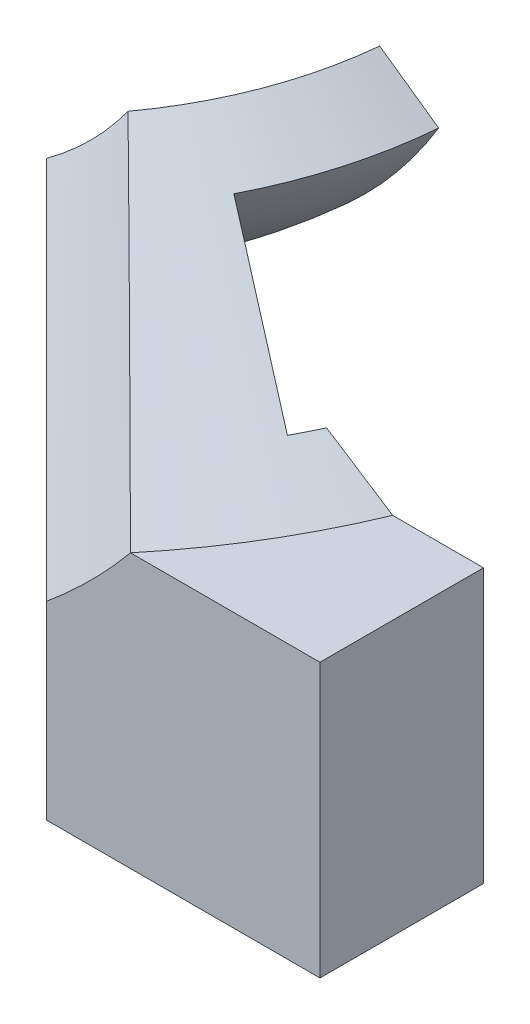
ISO-10303-21;
HEADER;
FILE_DESCRIPTION(('STEP AP214'),'2;1');
FILE_NAME('part.step','',(''),(''),'','','');
FILE_SCHEMA(('AUTOMOTIVE_DESIGN { 1 0 10303 214 1 1 1 1 }'));
ENDSEC;
DATA;
#1=APPLICATION_CONTEXT('core data for automotive mechanical design processes');
#2=APPLICATION_PROTOCOL_DEFINITION('international standard','automotive_design',2000,#1);
#3=PRODUCT_CONTEXT('',#1,'mechanical');
#4=PRODUCT('Part','Part','',(#3));
#5=PRODUCT_RELATED_PRODUCT_CATEGORY('part','',(#4));
#6=PRODUCT_DEFINITION_FORMATION('','',#4);
#7=PRODUCT_DEFINITION_CONTEXT('part definition',#1,'design');
#8=PRODUCT_DEFINITION('design','',#6,#7);
#9=PRODUCT_DEFINITION_SHAPE('','',#8);
#10=(LENGTH_UNIT() NAMED_UNIT(*) SI_UNIT(.MILLI.,.METRE.));
#11=(NAMED_UNIT(*) PLANE_ANGLE_UNIT() SI_UNIT($,.RADIAN.));
#12=(NAMED_UNIT(*) SI_UNIT($,.STERADIAN.) SOLID_ANGLE_UNIT());
#13=UNCERTAINTY_MEASURE_WITH_UNIT(LENGTH_MEASURE(1.E-05),#10,'distance_accuracy_value','');
#14=(GEOMETRIC_REPRESENTATION_CONTEXT(3) GLOBAL_UNCERTAINTY_ASSIGNED_CONTEXT((#13)) GLOBAL_UNIT_ASSIGNED_CONTEXT((#10,
#11,#12)) REPRESENTATION_CONTEXT('',''));
#15=CARTESIAN_POINT('',(0.,0.,0.));
#16=DIRECTION('',(0.,0.,1.));
#17=DIRECTION('',(1.,0.,0.));
#18=AXIS2_PLACEMENT_3D('',#15,#16,#17);
#19=CARTESIAN_POINT('',(32.4999999999999,0.,11.6843881753261));
#20=DIRECTION('',(0.,0.,1.));
#21=DIRECTION('',(-1.,0.,0.));
#22=AXIS2_PLACEMENT_3D('',#19,#20,#21);
#23=PLANE('',#22);
#24=DIRECTION('',(0.,-1.,0.));
#25=VECTOR('',#24,1.);
#26=CARTESIAN_POINT('',(32.5,-32.5000000000001,11.684388175326));
#27=LINE('',#26,#25);
#28=CARTESIAN_POINT('',(32.5,-19.4739802922102,11.6843881753261));
#29=VERTEX_POINT('',#28);
#30=CARTESIAN_POINT('',(32.5,-32.5,11.684388175326));
#31=VERTEX_POINT('',#30);
#32=EDGE_CURVE('E254',#29,#31,#27,.T.);
#33=ORIENTED_EDGE('',*,*,#32,.T.);
#34=DIRECTION('',(-1.,0.,0.));
#35=VECTOR('',#34,1.);
#36=CARTESIAN_POINT('',(-32.5,-32.5,11.684388175326));
#37=LINE('',#36,#35);
#38=CARTESIAN_POINT('',(19.4739802922103,-32.5,11.684388175326));
#39=VERTEX_POINT('',#38);
#40=EDGE_CURVE('E258',#31,#39,#37,.T.);
#41=ORIENTED_EDGE('',*,*,#40,.T.);
#42=DIRECTION('',(0.,-1.,0.));
#43=VECTOR('',#42,1.);
#44=CARTESIAN_POINT('',(19.4739802922102,0.,11.6843881753261));
#45=LINE('',#44,#43);
#46=CARTESIAN_POINT('',(19.4739802922103,-28.1731267872113,11.684388175326));
#47=VERTEX_POINT('',#46);
#48=EDGE_CURVE('E242',#47,#39,#45,.T.);
#49=ORIENTED_EDGE('',*,*,#48,.F.);
#50=CARTESIAN_POINT('',(6.66150909224901,4.09268941155782,11.6843881753262));
#51=CARTESIAN_POINT('',(6.60199703356695,3.83817192041305,11.6843881753261));
#52=CARTESIAN_POINT('',(6.54719646257599,3.58251870887626,11.6843881753261));
#53=CARTESIAN_POINT('',(6.44782877894426,3.06916031843288,11.6843881753261));
#54=CARTESIAN_POINT('',(6.40326460100592,2.81145457293441,11.6843881753261));
#55=CARTESIAN_POINT('',(6.32521049330741,2.29432540950897,11.6843881753261));
#56=CARTESIAN_POINT('',(6.29172190352489,2.03490178761511,11.6843881753261));
#57=CARTESIAN_POINT('',(6.2364958953045,1.51482567427837,11.6843881753261));
#58=CARTESIAN_POINT('',(6.2147573012011,1.254173308413,11.6843881753261));
#59=CARTESIAN_POINT('',(6.18393724188402,0.739537766201891,11.6843881753261));
#60=CARTESIAN_POINT('',(6.17451426011801,0.485575123244339,11.6843881753261));
#61=CARTESIAN_POINT('',(6.16739629798708,-0.0225419763424883,11.6843881753261));
#62=CARTESIAN_POINT('',(6.16970253489443,-0.276696450143395,11.6843881753261));
#63=CARTESIAN_POINT('',(6.18599474326854,-0.78453770364195,11.6843881753261));
#64=CARTESIAN_POINT('',(6.19997649428004,-1.03822461914721,11.6843881753261));
#65=CARTESIAN_POINT('',(6.23931833386677,-1.54468594984237,11.6843881753261));
#66=CARTESIAN_POINT('',(6.26467762711212,-1.79746042757003,11.6843881753261));
#67=CARTESIAN_POINT('',(6.33531244470313,-2.37560583107247,11.6843881753261));
#68=CARTESIAN_POINT('',(6.38424723528673,-2.70053390669696,11.6843881753261));
#69=CARTESIAN_POINT('',(6.49884446249238,-3.347404599148,11.6843881753261));
#70=CARTESIAN_POINT('',(6.56450861797306,-3.66934690567691,11.6843881753261));
#71=CARTESIAN_POINT('',(6.7841074276143,-4.63044191908238,11.6843881753261));
#72=CARTESIAN_POINT('',(6.96060277103621,-5.26451654658511,11.6843881753261));
#73=CARTESIAN_POINT('',(7.26090383974643,-6.2078928010951,11.6843881753261));
#74=CARTESIAN_POINT('',(7.36766627975163,-6.52289342235298,11.6843881753261));
#75=CARTESIAN_POINT('',(7.59134375896678,-7.1493004384332,11.6843881753261));
#76=CARTESIAN_POINT('',(7.70825889151362,-7.46070680018256,11.6843881753261));
#77=CARTESIAN_POINT('',(7.95073848244651,-8.07997067390555,11.6843881753261));
#78=CARTESIAN_POINT('',(8.07629961690286,-8.38782949716902,11.6843881753261));
#79=CARTESIAN_POINT('',(8.33486543313223,-9.00038163466393,11.6843881753261));
#80=CARTESIAN_POINT('',(8.4678697821737,-9.30507508967498,11.6843881753261));
#81=CARTESIAN_POINT('',(8.75369775859012,-9.94149484411256,11.6843881753261));
#82=CARTESIAN_POINT('',(8.90718234999694,-10.2729235712149,11.6843881753261));
#83=CARTESIAN_POINT('',(9.22068547832819,-10.9326840848201,11.6843881753261));
#84=CARTESIAN_POINT('',(9.38070428737969,-11.2610157416386,11.6843881753261));
#85=CARTESIAN_POINT('',(9.70632324924436,-11.9149698461735,11.6843881753261));
#86=CARTESIAN_POINT('',(9.87192442598707,-12.2405917830597,11.6843881753261));
#87=CARTESIAN_POINT('',(10.2078793217571,-12.8893778678742,11.6843881753261));
#88=CARTESIAN_POINT('',(10.3782331417583,-13.2125419633976,11.6843881753261));
#89=CARTESIAN_POINT('',(10.8956490960964,-14.1792627747122,11.6843881753261));
#90=CARTESIAN_POINT('',(11.2488167786067,-14.8195532899955,11.6843881753261));
#91=CARTESIAN_POINT('',(11.9672506412832,-16.0931933150105,11.6843881753261));
#92=CARTESIAN_POINT('',(12.3325157463137,-16.726543434934,11.6843881753261));
#93=CARTESIAN_POINT('',(13.0732206764012,-17.9892904131422,11.6843881753261));
#94=CARTESIAN_POINT('',(13.4486827362857,-18.6186742023265,11.6843881753261));
#95=CARTESIAN_POINT('',(14.2068761198116,-19.8730535971831,11.6843881753261));
#96=CARTESIAN_POINT('',(14.5896075768593,-20.4980491220342,11.6843881753261));
#97=CARTESIAN_POINT('',(15.360650580844,-21.7441987833536,11.6843881753261));
#98=CARTESIAN_POINT('',(15.7489595673113,-22.365354506329,11.6843881753261));
#99=CARTESIAN_POINT('',(16.5301953371116,-23.6047460688955,11.6843881753261));
#100=CARTESIAN_POINT('',(16.9231220899978,-24.2229819277005,11.6843881753261));
#101=CARTESIAN_POINT('',(17.7128609545798,-25.4572316804766,11.6843881753261));
#102=CARTESIAN_POINT('',(18.1096742183031,-26.0732448367085,11.684388175326));
#103=CARTESIAN_POINT('',(18.9064133084774,-27.3032543672393,11.684388175326));
#104=CARTESIAN_POINT('',(19.3063391384591,-27.9172507392493,11.684388175326));
#105=CARTESIAN_POINT('',(20.5100655326833,-29.7568325680077,11.684388175326));
#106=CARTESIAN_POINT('',(21.3177350405453,-30.9798862658247,11.684388175326));
#107=CARTESIAN_POINT('',(22.9394385168843,-33.4196154404303,11.684388175326));
#108=CARTESIAN_POINT('',(23.7534635649951,-34.6362968593092,11.684388175326));
#109=CARTESIAN_POINT('',(25.3869583161494,-37.0660008752834,11.684388175326));
#110=CARTESIAN_POINT('',(26.2064280304596,-38.2790234648,11.684388175326));
#111=CARTESIAN_POINT('',(27.5456236508881,-40.2540834330429,11.684388175326));
#112=CARTESIAN_POINT('',(28.0641008379958,-41.0169683911828,11.684388175326));
#113=CARTESIAN_POINT('',(29.1025760151542,-42.5419480960636,11.684388175326));
#114=CARTESIAN_POINT('',(29.6225743145226,-43.3040426321777,11.684388175326));
#115=CARTESIAN_POINT('',(30.6627206935197,-44.8258659980088,11.684388175326));
#116=CARTESIAN_POINT('',(31.1828663372309,-45.5855964931231,11.684388175326));
#117=CARTESIAN_POINT('',(32.2240848948699,-47.1041740704813,11.684388175326));
#118=CARTESIAN_POINT('',(32.7451575774702,-47.8630213113241,11.684388175326));
#119=CARTESIAN_POINT('',(33.2666732705076,-48.6215636721026,11.684388175326));
#120=B_SPLINE_CURVE_WITH_KNOTS('',3,(#50,#51,#52,#53,#54,#55,#56,#57,#58,#59,#60,#61,#62,#63,
#64,#65,#66,#67,#68,#69,#70,#71,#72,#73,#74,#75,#76,#77,#78,#79,#80,#81,#82,#83,#84,#85,#86,#87,
#88,#89,#90,#91,#92,#93,#94,#95,#96,#97,#98,#99,#100,#101,#102,#103,#104,#105,#106,#107,#108,
#109,#110,#111,#112,#113,#114,#115,#116,#117,#118,#119),.UNSPECIFIED.,.F.,.F.,(4,2,2,2,2,2,2,2,
2,2,2,2,2,2,2,2,2,2,2,2,2,2,2,2,2,2,2,2,2,2,2,2,2,2,4),(0.,0.784152360516005,1.56852925222489,
2.35300100691774,3.13739425543634,3.89953905583204,4.66176295413498,5.42371144357841,
6.18560667846066,7.17087002393161,8.1562346411399,10.1280069677653,11.1257117905067,
12.123425786434,13.1207583329065,14.1180463315109,15.2136908544898,16.309381053821,
17.4052733323368,18.5011889117507,20.6946810233994,22.8879787129329,25.0865193408995,
27.2851003550237,29.4827024290138,31.6802900215434,33.8785500155521,36.0768125034369,
40.4737812896237,44.8654102698392,49.257048340423,52.024231204559,54.792022496614,
57.554208650007,60.3157819829417),.UNSPECIFIED.);
#121=CARTESIAN_POINT('',(17.4361292638945,-25.0246158070959,11.684388175326));
#122=VERTEX_POINT('',#121);
#123=EDGE_CURVE('E164',#122,#47,#120,.T.);
#124=ORIENTED_EDGE('',*,*,#123,.F.);
#125=CARTESIAN_POINT('',(0.,0.,11.684388175326));
#126=DIRECTION('',(0.,0.,1.));
#127=DIRECTION('',(-1.,0.,0.));
#128=AXIS2_PLACEMENT_3D('',#125,#126,#127);
#129=CIRCLE('',#128,30.4999999999999);
#130=CARTESIAN_POINT('',(25.0246158070958,-17.4361292638943,11.6843881753261));
#131=VERTEX_POINT('',#130);
#132=EDGE_CURVE('E283',#122,#131,#129,.T.);
#133=ORIENTED_EDGE('',*,*,#132,.T.);
#134=CARTESIAN_POINT('',(2.22598304580772,-6.31792877389829,11.6843881753261));
#135=CARTESIAN_POINT('',(2.40163087749736,-6.34116819653544,11.6843881753261));
#136=CARTESIAN_POINT('',(2.57692202499282,-6.36702391834627,11.6843881753261));
#137=CARTESIAN_POINT('',(2.92666871882969,-6.42371853410047,11.6843881753261));
#138=CARTESIAN_POINT('',(3.10112439521381,-6.45455662473285,11.6843881753261));
#139=CARTESIAN_POINT('',(3.62289189356393,-6.55413569970406,11.6843881753261));
#140=CARTESIAN_POINT('',(3.96885449565901,-6.62997527262879,11.6843881753261));
#141=CARTESIAN_POINT('',(4.99853280735835,-6.88207842713656,11.6843881753261));
#142=CARTESIAN_POINT('',(5.67620094835625,-7.08323834249026,11.6843881753261));
#143=CARTESIAN_POINT('',(6.67654460939737,-7.42080368343023,11.6843881753261));
#144=CARTESIAN_POINT('',(7.00579646877906,-7.53866285069313,11.6843881753261));
#145=CARTESIAN_POINT('',(7.6605141162687,-7.78476117235676,11.6843881753261));
#146=CARTESIAN_POINT('',(7.9859790232086,-7.91300268943983,11.6843881753261));
#147=CARTESIAN_POINT('',(8.63367954219747,-8.17843562222149,11.6843881753261));
#148=CARTESIAN_POINT('',(8.95591071091824,-8.31563780704712,11.6843881753261));
#149=CARTESIAN_POINT('',(9.43675722743234,-8.52705358153626,11.6843881753261));
#150=CARTESIAN_POINT('',(9.59661481972396,-8.59845723858941,11.6843881753261));
#151=CARTESIAN_POINT('',(9.91554507489258,-8.74299705489993,11.6843881753261));
#152=CARTESIAN_POINT('',(10.0746177363896,-8.81613321720189,11.6843881753261));
#153=CARTESIAN_POINT('',(10.5789349171291,-9.0510812079796,11.6843881753261));
#154=CARTESIAN_POINT('',(10.9227898149725,-9.21588194247773,11.6843881753261));
#155=CARTESIAN_POINT('',(11.6073745661428,-9.55186557106293,11.6843881753261));
#156=CARTESIAN_POINT('',(11.9481042712857,-9.72304876585145,11.6843881753261));
#157=CARTESIAN_POINT('',(12.6268453659895,-10.0708462174993,11.6843881753261));
#158=CARTESIAN_POINT('',(12.964856311521,-10.2474613396618,11.6843881753261));
#159=CARTESIAN_POINT('',(13.6384315286224,-10.6053025489496,11.6843881753261));
#160=CARTESIAN_POINT('',(13.9739957524647,-10.7865287257139,11.6843881753261));
#161=CARTESIAN_POINT('',(14.9779311176507,-11.3363608723718,11.6843881753261));
#162=CARTESIAN_POINT('',(15.6430685229288,-11.7108739036933,11.6843881753261));
#163=CARTESIAN_POINT('',(16.966530615676,-12.4715625943866,11.6843881753261));
#164=CARTESIAN_POINT('',(17.6248558467463,-12.8577373133856,11.6843881753261));
#165=CARTESIAN_POINT('',(18.9371314448639,-13.6395926541308,11.6843881753261));
#166=CARTESIAN_POINT('',(19.5910740093801,-14.035286347211,11.6843881753261));
#167=CARTESIAN_POINT('',(20.8946978863798,-14.8336416284373,11.6843881753261));
#168=CARTESIAN_POINT('',(21.5443791271505,-15.2363033334338,11.6843881753261));
#169=CARTESIAN_POINT('',(22.8400278821029,-16.0469700064563,11.6843881753261));
#170=CARTESIAN_POINT('',(23.485996796937,-16.4549727387974,11.6843881753261));
#171=CARTESIAN_POINT('',(24.7751136344655,-17.2753975513658,11.6843881753261));
#172=CARTESIAN_POINT('',(25.4182615738867,-17.6878196053389,11.6843881753261));
#173=CARTESIAN_POINT('',(26.7093543367616,-18.5208598363385,11.6843881753261));
#174=CARTESIAN_POINT('',(27.3572732232512,-18.9415181818567,11.6843881753261));
#175=CARTESIAN_POINT('',(28.6511301974872,-19.7858694666355,11.6843881753261));
#176=CARTESIAN_POINT('',(29.2970682830347,-20.2095624092631,11.6843881753261));
#177=CARTESIAN_POINT('',(31.2325244027724,-21.4844836706313,11.6843881753261));
#178=CARTESIAN_POINT('',(32.5195629809169,-22.3394758537966,11.6843881753261));
#179=CARTESIAN_POINT('',(35.0877618558319,-24.0558472966385,11.6843881753261));
#180=CARTESIAN_POINT('',(36.368926259765,-24.9172204230658,11.6843881753261));
#181=CARTESIAN_POINT('',(38.9276971721967,-26.6452363765026,11.684388175326));
#182=CARTESIAN_POINT('',(40.2053036760976,-27.5118792103172,11.684388175326));
#183=CARTESIAN_POINT('',(41.8348964282946,-28.6210184950714,11.684388175326));
#184=CARTESIAN_POINT('',(42.188140675975,-28.8616691817263,11.684388175326));
#185=CARTESIAN_POINT('',(42.8944632624079,-29.3432786340869,11.684388175326));
#186=CARTESIAN_POINT('',(43.2475415844554,-29.5842374243005,11.684388175326));
#187=CARTESIAN_POINT('',(43.9523201838532,-30.0656056466041,11.684388175326));
#188=CARTESIAN_POINT('',(44.3040210783349,-30.306014175282,11.684388175326));
#189=CARTESIAN_POINT('',(45.0072230737821,-30.7870588150727,11.684388175326));
#190=CARTESIAN_POINT('',(45.3587241892537,-31.0276949049797,11.684388175326));
#191=CARTESIAN_POINT('',(45.7101462180866,-31.2684464225503,11.684388175326));
#192=B_SPLINE_CURVE_WITH_KNOTS('',3,(#134,#135,#136,#137,#138,#139,#140,#141,#142,#143,#144,
#145,#146,#147,#148,#149,#150,#151,#152,#153,#154,#155,#156,#157,#158,#159,#160,#161,#162,#163,
#164,#165,#166,#167,#168,#169,#170,#171,#172,#173,#174,#175,#176,#177,#178,#179,#180,#181,#182,
#183,#184,#185,#186,#187,#188,#189,#190,#191),.UNSPECIFIED.,.F.,.F.,(4,2,2,2,2,2,2,2,2,2,2,2,2,
2,2,2,2,2,2,2,2,2,2,2,2,2,2,2,4),(0.,0.531498919296685,1.06291222999121,2.12498223362945,
4.2426000628392,5.29164032209994,6.34091998320012,7.39148476203068,7.91671500587795,
8.44194617279257,9.585781227489,10.7296702407757,11.8737424285481,13.0178368741332,
15.3076346531146,17.5972482783574,19.8902090812507,22.1832083734103,24.4752767292853,
26.7673314760099,29.0848135479098,31.4022981915905,36.0377010814228,40.6691127993079,
45.3005304992889,46.5828129374191,47.8652046564766,49.1432530752627,50.4211922682879),.UNSPECIFIED.);
#193=CARTESIAN_POINT('',(28.1731267872114,-19.4739802922102,11.6843881753261));
#194=VERTEX_POINT('',#193);
#195=EDGE_CURVE('E218',#131,#194,#192,.T.);
#196=ORIENTED_EDGE('',*,*,#195,.T.);
#197=DIRECTION('',(1.,0.,0.));
#198=VECTOR('',#197,1.);
#199=CARTESIAN_POINT('',(32.4999999999998,-19.4739802922102,11.6843881753261));
#200=LINE('',#199,#198);
#201=EDGE_CURVE('E74',#194,#29,#200,.T.);
#202=ORIENTED_EDGE('',*,*,#201,.T.);
#203=EDGE_LOOP('',(#33,#41,#49,#124,#133,#196,#202));
#204=FACE_BOUND('',#203,.T.);
#205=ADVANCED_FACE('F37',(#204),#23,.F.);
#206=CARTESIAN_POINT('',(32.4999999999998,0.,19.4739802922102));
#207=DIRECTION('',(0.,0.,-1.));
#208=DIRECTION('',(1.,0.,0.));
#209=AXIS2_PLACEMENT_3D('',#206,#207,#208);
#210=PLANE('',#209);
#211=DIRECTION('',(0.,1.,0.));
#212=VECTOR('',#211,1.);
#213=CARTESIAN_POINT('',(32.5,-32.5000000000002,19.4739802922101));
#214=LINE('',#213,#212);
#215=CARTESIAN_POINT('',(32.5,-32.5,19.4739802922101));
#216=VERTEX_POINT('',#215);
#217=CARTESIAN_POINT('',(32.5,-19.4739802922104,19.4739802922101));
#218=VERTEX_POINT('',#217);
#219=EDGE_CURVE('E256',#216,#218,#214,.T.);
#220=ORIENTED_EDGE('',*,*,#219,.T.);
#221=DIRECTION('',(-1.,0.,0.));
#222=VECTOR('',#221,1.);
#223=CARTESIAN_POINT('',(32.4999999999998,-19.4739802922102,19.4739802922101));
#224=LINE('',#223,#222);
#225=CARTESIAN_POINT('',(23.4736893474076,-19.4739802922102,19.4739802922101));
#226=VERTEX_POINT('',#225);
#227=EDGE_CURVE('E82',#218,#226,#224,.T.);
#228=ORIENTED_EDGE('',*,*,#227,.T.);
#229=CARTESIAN_POINT('',(0.,0.,19.4739802922102));
#230=DIRECTION('',(0.,0.,1.));
#231=DIRECTION('',(-1.,0.,0.));
#232=AXIS2_PLACEMENT_3D('',#229,#230,#231);
#233=CIRCLE('',#232,30.4999999999998);
#234=CARTESIAN_POINT('',(19.4739802922103,-23.4736893474076,19.4739802922101));
#235=VERTEX_POINT('',#234);
#236=EDGE_CURVE('E150',#235,#226,#233,.T.);
#237=ORIENTED_EDGE('',*,*,#236,.F.);
#238=DIRECTION('',(0.,1.,0.));
#239=VECTOR('',#238,1.);
#240=CARTESIAN_POINT('',(19.4739802922102,-1.07552855510562E-13,19.4739802922102));
#241=LINE('',#240,#239);
#242=CARTESIAN_POINT('',(19.4739802922103,-32.5,19.4739802922101));
#243=VERTEX_POINT('',#242);
#244=EDGE_CURVE('E55',#243,#235,#241,.T.);
#245=ORIENTED_EDGE('',*,*,#244,.F.);
#246=DIRECTION('',(1.,0.,0.));
#247=VECTOR('',#246,1.);
#248=CARTESIAN_POINT('',(-32.5,-32.5,19.4739802922101));
#249=LINE('',#248,#247);
#250=EDGE_CURVE('E261',#243,#216,#249,.T.);
#251=ORIENTED_EDGE('',*,*,#250,.T.);
#252=EDGE_LOOP('',(#220,#228,#237,#245,#251));
#253=FACE_BOUND('',#252,.T.);
#254=ADVANCED_FACE('F234',(#253),#210,.F.);
#255=CARTESIAN_POINT('',(0.,0.,19.4739802922102));
#256=DIRECTION('',(0.,0.,1.));
#257=DIRECTION('',(-1.,0.,0.));
#258=AXIS2_PLACEMENT_3D('',#255,#256,#257);
#259=CONICAL_SURFACE('',#258,30.4999999999998,0.955316618124508);
#260=CARTESIAN_POINT('',(23.4738909308181,-19.4741802922102,19.4741802922101));
#261=CARTESIAN_POINT('',(22.7101001064626,-18.7164266419262,18.7164266419261));
#262=CARTESIAN_POINT('',(21.9459701488568,-17.9588435691827,17.9588435691827));
#263=CARTESIAN_POINT('',(20.4166491520076,-16.444215663745,16.444215663745));
#264=CARTESIAN_POINT('',(19.6514581150735,-15.6871708298847,15.6871708298847));
#265=CARTESIAN_POINT('',(18.1196276592264,-14.1738120372715,14.1738120372714));
#266=CARTESIAN_POINT('',(17.3529882381043,-13.4174980796359,13.4174980796358));
#267=CARTESIAN_POINT('',(16.2014221397684,-12.2838419721871,12.283841972187));
#268=CARTESIAN_POINT('',(15.8172985280987,-11.9060919983213,11.9060919983212));
#269=CARTESIAN_POINT('',(15.0483761703602,-11.1509354971935,11.1509354971935));
#270=CARTESIAN_POINT('',(14.6635774239313,-10.7735289701148,10.7735289701148));
#271=CARTESIAN_POINT('',(14.278371437784,-10.3963301491595,10.3963301491595));
#272=B_SPLINE_CURVE_WITH_KNOTS('',3,(#260,#261,#262,#263,#264,#265,#266,#267,#268,#269,#270,
#271),.UNSPECIFIED.,.F.,.F.,(4,2,2,2,2,4),(0.,3.9478883475227,7.89576811623766,11.8436539110033,
13.8176010932539,15.7915493284936),.UNSPECIFIED.);
#273=CARTESIAN_POINT('',(14.278575689074,-10.3965301491595,10.3965301491595));
#274=VERTEX_POINT('',#273);
#275=EDGE_CURVE('E146',#226,#274,#272,.T.);
#276=ORIENTED_EDGE('',*,*,#275,.T.);
#277=CARTESIAN_POINT('',(0.,0.,10.3965301491595));
#278=DIRECTION('',(0.,0.,1.));
#279=DIRECTION('',(-1.,0.,0.));
#280=AXIS2_PLACEMENT_3D('',#277,#278,#279);
#281=CIRCLE('',#280,17.662546895932);
#282=CARTESIAN_POINT('',(10.3965301491596,-14.278575689074,10.3965301491595));
#283=VERTEX_POINT('',#282);
#284=EDGE_CURVE('E41',#283,#274,#281,.T.);
#285=ORIENTED_EDGE('',*,*,#284,.F.);
#286=CARTESIAN_POINT('',(19.4741802922103,-23.473890930818,19.4741802922101));
#287=CARTESIAN_POINT('',(18.7164266419263,-22.7101001064626,18.7164266419261));
#288=CARTESIAN_POINT('',(17.9588435691828,-21.9459701488568,17.9588435691827));
#289=CARTESIAN_POINT('',(16.4442156637451,-20.4166491520075,16.444215663745));
#290=CARTESIAN_POINT('',(15.6871708298848,-19.6514581150735,15.6871708298847));
#291=CARTESIAN_POINT('',(14.1738120372715,-18.1196276592264,14.1738120372714));
#292=CARTESIAN_POINT('',(13.417498079636,-17.3529882381043,13.4174980796358));
#293=CARTESIAN_POINT('',(12.2838419721871,-16.2014221397683,12.283841972187));
#294=CARTESIAN_POINT('',(11.9060919983213,-15.8172985280987,11.9060919983212));
#295=CARTESIAN_POINT('',(11.1509354971936,-15.0483761703602,11.1509354971935));
#296=CARTESIAN_POINT('',(10.7735289701149,-14.6635774239313,10.7735289701148));
#297=CARTESIAN_POINT('',(10.3963301491596,-14.278371437784,10.3963301491595));
#298=B_SPLINE_CURVE_WITH_KNOTS('',3,(#286,#287,#288,#289,#290,#291,#292,#293,#294,#295,#296,
#297),.UNSPECIFIED.,.F.,.F.,(4,2,2,2,2,4),(0.,3.9478883475227,7.89576811623767,11.8436539110034,
13.8176010932539,15.7915493284936),.UNSPECIFIED.);
#299=EDGE_CURVE('E135',#235,#283,#298,.T.);
#300=ORIENTED_EDGE('',*,*,#299,.F.);
#301=ORIENTED_EDGE('',*,*,#236,.T.);
#302=EDGE_LOOP('',(#276,#285,#300,#301));
#303=FACE_BOUND('',#302,.T.);
#304=ADVANCED_FACE('F144',(#303),#259,.F.);
#305=CARTESIAN_POINT('',(0.,0.,0.));
#306=DIRECTION('',(0.,0.,1.));
#307=DIRECTION('',(1.,0.,0.));
#308=AXIS2_PLACEMENT_3D('',#305,#306,#307);
#309=SPHERICAL_SURFACE('',#308,32.6615205866428);
#310=CARTESIAN_POINT('',(0.,-17.4361292638944,0.));
#311=DIRECTION('',(0.,1.,0.));
#312=DIRECTION('',(-1.,0.,0.));
#313=AXIS2_PLACEMENT_3D('',#310,#311,#312);
#314=CIRCLE('',#313,27.6180434376597);
#315=CARTESIAN_POINT('',(24.4048556033647,-17.4361292638944,12.9290118069161));
#316=VERTEX_POINT('',#315);
#317=EDGE_CURVE('E214',#316,#131,#314,.T.);
#318=ORIENTED_EDGE('',*,*,#317,.T.);
#319=ORIENTED_EDGE('',*,*,#132,.F.);
#320=CARTESIAN_POINT('',(17.4361292638944,0.,0.));
#321=DIRECTION('',(-1.,0.,0.));
#322=DIRECTION('',(0.,-1.,0.));
#323=AXIS2_PLACEMENT_3D('',#320,#321,#322);
#324=CIRCLE('',#323,27.6180434376597);
#325=CARTESIAN_POINT('',(17.4361292638945,-24.4048556033647,12.929011806916));
#326=VERTEX_POINT('',#325);
#327=EDGE_CURVE('E195',#326,#122,#324,.F.);
#328=ORIENTED_EDGE('',*,*,#327,.F.);
#329=CARTESIAN_POINT('',(0.,0.,12.9290118069161));
#330=DIRECTION('',(0.,0.,1.));
#331=DIRECTION('',(-1.,0.,0.));
#332=AXIS2_PLACEMENT_3D('',#329,#330,#331);
#333=CIRCLE('',#332,29.9935923278342);
#334=EDGE_CURVE('E285',#326,#316,#333,.T.);
#335=ORIENTED_EDGE('',*,*,#334,.T.);
#336=EDGE_LOOP('',(#318,#319,#328,#335));
#337=FACE_BOUND('',#336,.T.);
#338=ADVANCED_FACE('F202',(#337),#309,.F.);
#339=CARTESIAN_POINT('',(20.4238486312594,0.,1.70874488464022));
#340=DIRECTION('',(0.,0.,1.));
#341=DIRECTION('',(-1.,0.,0.));
#342=AXIS2_PLACEMENT_3D('',#339,#340,#341);
#343=PLANE('',#342);
#344=CARTESIAN_POINT('',(-5.78367541185474,-2.17165252220601,1.70874488464021));
#345=CARTESIAN_POINT('',(-5.58223830999317,-2.03509198051195,1.70874488464021));
#346=CARTESIAN_POINT('',(-5.38056775199202,-1.89887068712252,1.70874488464021));
#347=CARTESIAN_POINT('',(-4.9763008229625,-1.62738415926375,1.70874488464021));
#348=CARTESIAN_POINT('',(-4.77370374376073,-1.4921199800833,1.70874488464021));
#349=CARTESIAN_POINT('',(-4.35923799432773,-1.21760995024666,1.70874488464021));
#350=CARTESIAN_POINT('',(-4.14732794804102,-1.07842647682622,1.70874488464021));
#351=CARTESIAN_POINT('',(-3.72211419489787,-0.80262395776089,1.70874488464022));
#352=CARTESIAN_POINT('',(-3.50881195432968,-0.66600266449002,1.70874488464022));
#353=CARTESIAN_POINT('',(-3.18717940775806,-0.464128853266087,1.70874488464022));
#354=CARTESIAN_POINT('',(-3.0797766412102,-0.397400250754799,1.70874488464022));
#355=CARTESIAN_POINT('',(-2.86418026698684,-0.265235005291332,1.70874488464022));
#356=CARTESIAN_POINT('',(-2.75598667627486,-0.199798334737458,1.70874488464022));
#357=CARTESIAN_POINT('',(-2.53825013745727,-0.0704414390706268,1.70874488464022));
#358=CARTESIAN_POINT('',(-2.42870409661329,-0.00652640266554971,1.70874488464022));
#359=CARTESIAN_POINT('',(-2.20827851921634,0.118945290146372,1.70874488464022));
#360=CARTESIAN_POINT('',(-2.09739913249043,0.180502208338857,1.70874488464022));
#361=CARTESIAN_POINT('',(-1.87615444554485,0.299085230732086,1.70874488464022));
#362=CARTESIAN_POINT('',(-1.76582535670298,0.356178423359426,1.70874488464022));
#363=CARTESIAN_POINT('',(-1.5428398550247,0.465857007764645,1.70874488464022));
#364=CARTESIAN_POINT('',(-1.43018213002029,0.518439766987354,1.70874488464022));
#365=CARTESIAN_POINT('',(-1.20252193230387,0.616673418009769,1.70874488464022));
#366=CARTESIAN_POINT('',(-1.08753439562889,0.662358381733081,1.70874488464022));
#367=CARTESIAN_POINT('',(-0.854166265425354,0.743856848329806,1.70874488464022));
#368=CARTESIAN_POINT('',(-0.735791211114582,0.779685551867798,1.70874488464022));
#369=CARTESIAN_POINT('',(-0.539657286476143,0.826693672905467,1.70874488464022));
#370=CARTESIAN_POINT('',(-0.462920577224645,0.842094195558335,1.70874488464022));
#371=CARTESIAN_POINT('',(-0.308364397684042,0.866150168459969,1.70874488464022));
#372=CARTESIAN_POINT('',(-0.23054488791025,0.874805372078831,1.70874488464022));
#373=CARTESIAN_POINT('',(-0.0749135335041879,0.884583970793949,1.70874488464022));
#374=CARTESIAN_POINT('',(0.00289527041112912,0.885754475436874,1.70874488464022));
#375=CARTESIAN_POINT('',(0.158265419941042,0.880582904696699,1.70874488464022));
#376=CARTESIAN_POINT('',(0.235826720910642,0.874239543136502,1.70874488464022));
#377=CARTESIAN_POINT('',(0.411650422469944,0.851840560439028,1.70874488464022));
#378=CARTESIAN_POINT('',(0.509627226424006,0.833562528563021,1.70874488464022));
#379=CARTESIAN_POINT('',(0.703377048020235,0.787754236712943,1.70874488464022));
#380=CARTESIAN_POINT('',(0.799148478986512,0.760217524835853,1.70874488464022));
#381=CARTESIAN_POINT('',(0.989584629059168,0.697809091702969,1.70874488464022));
#382=CARTESIAN_POINT('',(1.08421947568298,0.662847965290969,1.70874488464022));
#383=CARTESIAN_POINT('',(1.22456534424487,0.606523964440714,1.70874488464022));
#384=CARTESIAN_POINT('',(1.27107590279715,0.587103957949688,1.70874488464022));
#385=CARTESIAN_POINT('',(1.36361538815506,0.547151474486375,1.70874488464022));
#386=CARTESIAN_POINT('',(1.40964433537843,0.526619044904772,1.70874488464022));
#387=CARTESIAN_POINT('',(1.55524669933891,0.459863390442374,1.70874488464023));
#388=CARTESIAN_POINT('',(1.65400998058356,0.411873844274328,1.70874488464022));
#389=CARTESIAN_POINT('',(1.84992484721962,0.312697021740194,1.70874488464022));
#390=CARTESIAN_POINT('',(1.94707606941571,0.261509036823583,1.70874488464022));
#391=CARTESIAN_POINT('',(2.14017224227543,0.15676151697946,1.70874488464022));
#392=CARTESIAN_POINT('',(2.23611632500669,0.103200388347019,1.70874488464022));
#393=CARTESIAN_POINT('',(2.42700652526197,-0.00567563738315525,1.70874488464022));
#394=CARTESIAN_POINT('',(2.52195258833199,-0.0609906295206941,1.70874488464022));
#395=CARTESIAN_POINT('',(2.80602674720243,-0.22915790673319,1.70874488464022));
#396=CARTESIAN_POINT('',(2.99397403978803,-0.344001248920832,1.70874488464022));
#397=CARTESIAN_POINT('',(3.36776694657745,-0.576862460987211,1.70874488464022));
#398=CARTESIAN_POINT('',(3.55361338325142,-0.694879022793687,1.70874488464022));
#399=CARTESIAN_POINT('',(3.92348426067707,-0.932752296199035,1.70874488464022));
#400=CARTESIAN_POINT('',(4.10751203238139,-1.05260383697415,1.70874488464022));
#401=CARTESIAN_POINT('',(4.4746257713356,-1.2937771734114,1.70874488464022));
#402=CARTESIAN_POINT('',(4.65771164159447,-1.41509911633413,1.70874488464021));
#403=CARTESIAN_POINT('',(5.02292312303414,-1.65861519442803,1.70874488464021));
#404=CARTESIAN_POINT('',(5.20504973379168,-1.7808078320412,1.70874488464021));
#405=CARTESIAN_POINT('',(5.56877394369983,-2.02596394810662,1.70874488464021));
#406=CARTESIAN_POINT('',(5.75037156051939,-2.14892740037023,1.70874488464022));
#407=CARTESIAN_POINT('',(6.29207445885921,-2.51699398416859,1.70874488464022));
#408=CARTESIAN_POINT('',(6.6515973899789,-2.76295383166498,1.70874488464021));
#409=CARTESIAN_POINT('',(7.36967712342855,-3.25628058723046,1.70874488464021));
#410=CARTESIAN_POINT('',(7.72823392119164,-3.50364750193356,1.70874488464021));
#411=CARTESIAN_POINT('',(8.44470708830648,-3.99932493961805,1.70874488464021));
#412=CARTESIAN_POINT('',(8.80262344220293,-4.24763548493137,1.70874488464021));
#413=CARTESIAN_POINT('',(9.51800212635565,-4.74490989769217,1.7087448846402));
#414=CARTESIAN_POINT('',(9.87546445628832,-4.99387376560493,1.7087448846402));
#415=CARTESIAN_POINT('',(10.947765753475,-5.74174120080535,1.7087448846402));
#416=CARTESIAN_POINT('',(11.6621180127153,-6.24134246212872,1.7087448846402));
#417=CARTESIAN_POINT('',(13.0900804650644,-7.24158722595571,1.7087448846402));
#418=CARTESIAN_POINT('',(13.8036906659894,-7.74223071731106,1.7087448846402));
#419=CARTESIAN_POINT('',(15.2298824294698,-8.7437860996684,1.70874488464019));
#420=CARTESIAN_POINT('',(15.9424643594131,-9.24469746756553,1.70874488464019));
#421=CARTESIAN_POINT('',(17.3673193558518,-10.2469634843001,1.70874488464019));
#422=CARTESIAN_POINT('',(18.0795924214647,-10.7483181343917,1.70874488464019));
#423=CARTESIAN_POINT('',(20.2158554681569,-12.2526711551139,1.70874488464018));
#424=CARTESIAN_POINT('',(21.6395251268787,-13.2561243654009,1.70874488464018));
#425=CARTESIAN_POINT('',(24.4720056415658,-15.2535248065921,1.70874488464017));
#426=CARTESIAN_POINT('',(25.8808211070198,-16.2474655029889,1.70874488464017));
#427=CARTESIAN_POINT('',(28.6982510892344,-18.2357954664855,1.70874488464016));
#428=CARTESIAN_POINT('',(30.1068655907557,-19.2301847551789,1.70874488464016));
#429=CARTESIAN_POINT('',(32.924756678518,-21.2198121466405,1.70874488464016));
#430=CARTESIAN_POINT('',(34.3340331573421,-22.2150504015291,1.70874488464015));
#431=CARTESIAN_POINT('',(37.1523803499692,-24.2056538137481,1.70874488464015));
#432=CARTESIAN_POINT('',(38.5614510708254,-25.2010189610922,1.70874488464014));
#433=CARTESIAN_POINT('',(39.9704834625725,-26.196438348309,1.70874488464013));
#434=B_SPLINE_CURVE_WITH_KNOTS('',3,(#344,#345,#346,#347,#348,#349,#350,#351,#352,#353,#354,
#355,#356,#357,#358,#359,#360,#361,#362,#363,#364,#365,#366,#367,#368,#369,#370,#371,#372,#373,
#374,#375,#376,#377,#378,#379,#380,#381,#382,#383,#384,#385,#386,#387,#388,#389,#390,#391,#392,
#393,#394,#395,#396,#397,#398,#399,#400,#401,#402,#403,#404,#405,#406,#407,#408,#409,#410,#411,
#412,#413,#414,#415,#416,#417,#418,#419,#420,#421,#422,#423,#424,#425,#426,#427,#428,#429,#430,
#431,#432,#433),.UNSPECIFIED.,.F.,.F.,(4,2,2,2,2,2,2,2,2,2,2,2,2,2,2,2,2,2,2,2,2,2,2,2,2,2,2,2,
2,2,2,2,2,2,2,2,2,2,2,2,2,2,2,2,4),(0.,0.730094000916926,1.46089603813238,2.22147989009861,
2.98136197578493,3.36068710089772,3.74000411306709,4.12046908956504,4.50089170575146,
4.87350122917407,5.24632677036361,5.61724582457296,5.98758958605132,6.22214148919563,
6.45670196788681,6.68978463093663,6.92290719739993,7.22131534575122,7.51993187202491,
7.82237198029273,7.97356779566187,8.12475717494782,8.45408037286806,8.78347678624156,
9.11309786465296,9.44273683547394,10.1034440535816,10.7638829671983,11.4227163620418,
12.0816162933445,12.7395727917721,13.3975070558264,14.7043199038912,16.0111389184025,
17.3179890550927,18.6248401227447,21.2400063441298,23.8551447345125,26.4682205802331,
29.0813038421477,34.3066055845071,39.4790432573534,44.6517643309374,49.8275767558366,
55.0031045989185),.UNSPECIFIED.);
#435=CARTESIAN_POINT('',(17.5796972035986,-10.3965301491595,1.70874488464017));
#436=VERTEX_POINT('',#435);
#437=CARTESIAN_POINT('',(20.3897907210229,-12.3755228603499,1.70874488464019));
#438=VERTEX_POINT('',#437);
#439=EDGE_CURVE('E67',#436,#438,#434,.T.);
#440=ORIENTED_EDGE('',*,*,#439,.T.);
#441=CARTESIAN_POINT('',(0.,0.,1.70874488464023));
#442=DIRECTION('',(0.,0.,1.));
#443=DIRECTION('',(-1.,0.,0.));
#444=AXIS2_PLACEMENT_3D('',#441,#442,#443);
#445=CIRCLE('',#444,23.8515645548495);
#446=CARTESIAN_POINT('',(12.3755228603499,-20.3897907210229,1.70874488464016));
#447=VERTEX_POINT('',#446);
#448=EDGE_CURVE('E296',#447,#438,#445,.T.);
#449=ORIENTED_EDGE('',*,*,#448,.F.);
#450=CARTESIAN_POINT('',(-0.661182690064457,-1.08586959948528,1.70874488464022));
#451=CARTESIAN_POINT('',(-0.644506798860155,-1.12983151226507,1.70874488464022));
#452=CARTESIAN_POINT('',(-0.627208226773268,-1.17355156591191,1.70874488464021));
#453=CARTESIAN_POINT('',(-0.591525770375741,-1.26053850507146,1.70874488464021));
#454=CARTESIAN_POINT('',(-0.5731420721085,-1.30380546677709,1.70874488464021));
#455=CARTESIAN_POINT('',(-0.51662169471311,-1.43293250549054,1.70874488464021));
#456=CARTESIAN_POINT('',(-0.477091106582665,-1.51818234420538,1.70874488464021));
#457=CARTESIAN_POINT('',(-0.395346038961554,-1.6871628687114,1.70874488464021));
#458=CARTESIAN_POINT('',(-0.353137015977629,-1.77089622297943,1.70874488464021));
#459=CARTESIAN_POINT('',(-0.266616211950956,-1.9372867113519,1.70874488464021));
#460=CARTESIAN_POINT('',(-0.222303990381525,-2.01994361532627,1.70874488464021));
#461=CARTESIAN_POINT('',(-0.0871724811519011,-2.26625039794434,1.70874488464021));
#462=CARTESIAN_POINT('',(0.00602097969916995,-2.42859548195598,1.70874488464021));
#463=CARTESIAN_POINT('',(0.148762247775021,-2.67041193693481,1.70874488464021));
#464=CARTESIAN_POINT('',(0.19685068822711,-2.75075983025741,1.70874488464021));
#465=CARTESIAN_POINT('',(0.293835243176571,-2.91097012053775,1.70874488464021));
#466=CARTESIAN_POINT('',(0.342731371399827,-2.99083250921318,1.70874488464021));
#467=CARTESIAN_POINT('',(0.489482174954532,-3.22834694434196,1.70874488464021));
#468=CARTESIAN_POINT('',(0.588284637784056,-3.38541250917946,1.70874488464021));
#469=CARTESIAN_POINT('',(0.787639981795009,-3.6984305025153,1.7087448846402));
#470=CARTESIAN_POINT('',(0.888192911285413,-3.85438290012469,1.7087448846402));
#471=CARTESIAN_POINT('',(1.09056414034534,-4.16548007736398,1.7087448846402));
#472=CARTESIAN_POINT('',(1.19238253430464,-4.3206247955103,1.7087448846402));
#473=CARTESIAN_POINT('',(1.3969535706183,-4.63029751933526,1.7087448846402));
#474=CARTESIAN_POINT('',(1.499706218633,-4.78482552126923,1.7087448846402));
#475=CARTESIAN_POINT('',(1.80899944557612,-5.24768312229609,1.7087448846402));
#476=CARTESIAN_POINT('',(2.01659088623137,-5.55531009512179,1.7087448846402));
#477=CARTESIAN_POINT('',(2.43347213425498,-6.16938581317466,1.7087448846402));
#478=CARTESIAN_POINT('',(2.64276185839593,-6.47583461506836,1.7087448846402));
#479=CARTESIAN_POINT('',(3.06336400649571,-7.08924511063342,1.7087448846402));
#480=CARTESIAN_POINT('',(3.27468123992498,-7.39620350491562,1.70874488464019));
#481=CARTESIAN_POINT('',(3.69811029935509,-8.00957698243433,1.70874488464019));
#482=CARTESIAN_POINT('',(3.9102221352744,-8.31599205881817,1.70874488464019));
#483=CARTESIAN_POINT('',(4.335004208652,-8.92840753539519,1.70874488464019));
#484=CARTESIAN_POINT('',(4.54767441181935,-9.2344079593809,1.70874488464019));
#485=CARTESIAN_POINT('',(4.97343962016596,-9.84611115447978,1.70874488464019));
#486=CARTESIAN_POINT('',(5.18653462358028,-10.1518139268218,1.70874488464019));
#487=CARTESIAN_POINT('',(5.79001843905308,-11.016592290217,1.70874488464018));
#488=CARTESIAN_POINT('',(6.18078476762642,-11.5754043996025,1.70874488464018));
#489=CARTESIAN_POINT('',(6.96300952784626,-12.6925440872752,1.70874488464018));
#490=CARTESIAN_POINT('',(7.35446795978725,-13.2508716653562,1.70874488464017));
#491=CARTESIAN_POINT('',(8.52954203055705,-14.9253682559594,1.70874488464017));
#492=CARTESIAN_POINT('',(9.31385442962183,-16.0410482436643,1.70874488464017));
#493=CARTESIAN_POINT('',(10.8834610240256,-18.271767413718,1.70874488464016));
#494=CARTESIAN_POINT('',(11.6687552483613,-19.3868065756501,1.70874488464016));
#495=CARTESIAN_POINT('',(13.2399214482886,-21.6164759132991,1.70874488464015));
#496=CARTESIAN_POINT('',(14.0257934232347,-22.7311060894708,1.70874488464014));
#497=CARTESIAN_POINT('',(15.5878482908236,-24.9458474830031,1.70874488464014));
#498=CARTESIAN_POINT('',(16.3640265049605,-26.04596200065,1.70874488464013));
#499=CARTESIAN_POINT('',(17.9166286699377,-28.2460182251854,1.70874488464013));
#500=CARTESIAN_POINT('',(18.6930526208691,-29.3459599320094,1.70874488464012));
#501=CARTESIAN_POINT('',(20.2460463099127,-31.5456813987534,1.70874488464012));
#502=CARTESIAN_POINT('',(21.022616041809,-32.645461163062,1.70874488464011));
#503=CARTESIAN_POINT('',(22.5758860129978,-34.8449278684726,1.70874488464011));
#504=CARTESIAN_POINT('',(23.3525862522379,-35.9446148096116,1.7087448846401));
#505=CARTESIAN_POINT('',(24.1293305196041,-37.0442706444382,1.70874488464009));
#506=B_SPLINE_CURVE_WITH_KNOTS('',3,(#450,#451,#452,#453,#454,#455,#456,#457,#458,#459,#460,
#461,#462,#463,#464,#465,#466,#467,#468,#469,#470,#471,#472,#473,#474,#475,#476,#477,#478,#479,
#480,#481,#482,#483,#484,#485,#486,#487,#488,#489,#490,#491,#492,#493,#494,#495,#496,#497,#498,
#499,#500,#501,#502,#503,#504,#505),.UNSPECIFIED.,.F.,.F.,(4,2,2,2,2,2,2,2,2,2,2,2,2,2,2,2,2,2,
2,2,2,2,2,2,2,2,2,4),(0.,0.141042526864211,0.282060942024627,0.563893344218239,
0.845168965932546,1.12650376465208,1.68797007132221,1.96888659108697,2.24980788968167,
2.80646133005234,3.36313015724672,3.91984075803558,4.47655473399742,5.58989740752825,
6.70318584533781,7.82117581085934,8.93917977828086,10.0571166209261,11.1750488284495,
13.2207075907963,15.2663672238007,19.3576970369356,23.4491506784306,27.5405997555061,
31.5797012460143,35.6188042383406,39.657762597397,43.6967193396821),.UNSPECIFIED.);
#507=CARTESIAN_POINT('',(10.3965301491596,-17.5796972035986,1.70874488464014));
#508=VERTEX_POINT('',#507);
#509=EDGE_CURVE('E156',#508,#447,#506,.T.);
#510=ORIENTED_EDGE('',*,*,#509,.F.);
#511=CARTESIAN_POINT('',(0.,0.,1.7087448846402));
#512=DIRECTION('',(0.,0.,1.));
#513=DIRECTION('',(-1.,0.,0.));
#514=AXIS2_PLACEMENT_3D('',#511,#512,#513);
#515=CIRCLE('',#514,20.4238486312594);
#516=EDGE_CURVE('E152',#508,#436,#515,.T.);
#517=ORIENTED_EDGE('',*,*,#516,.T.);
#518=EDGE_LOOP('',(#440,#449,#510,#517));
#519=FACE_BOUND('',#518,.T.);
#520=ADVANCED_FACE('F268',(#519),#343,.F.);
#521=CARTESIAN_POINT('',(0.,0.,0.));
#522=DIRECTION('',(0.,0.,1.));
#523=DIRECTION('',(1.,0.,0.));
#524=AXIS2_PLACEMENT_3D('',#521,#522,#523);
#525=SPHERICAL_SURFACE('',#524,20.4952043657383);
#526=CARTESIAN_POINT('',(0.,-10.3965301491595,0.));
#527=DIRECTION('',(0.,1.,0.));
#528=DIRECTION('',(-1.,0.,0.));
#529=AXIS2_PLACEMENT_3D('',#526,#527,#528);
#530=CIRCLE('',#529,17.662546895932);
#531=EDGE_CURVE('E298',#274,#436,#530,.T.);
#532=ORIENTED_EDGE('',*,*,#531,.T.);
#533=ORIENTED_EDGE('',*,*,#516,.F.);
#534=CARTESIAN_POINT('',(10.3965301491595,0.,0.));
#535=DIRECTION('',(-1.,0.,0.));
#536=DIRECTION('',(0.,-1.,0.));
#537=AXIS2_PLACEMENT_3D('',#534,#535,#536);
#538=CIRCLE('',#537,17.662546895932);
#539=EDGE_CURVE('E47',#283,#508,#538,.F.);
#540=ORIENTED_EDGE('',*,*,#539,.F.);
#541=ORIENTED_EDGE('',*,*,#284,.T.);
#542=EDGE_LOOP('',(#532,#533,#540,#541));
#543=FACE_BOUND('',#542,.T.);
#544=ADVANCED_FACE('F151',(#543),#525,.F.);
#545=CARTESIAN_POINT('',(0.,0.,9.29948381331429));
#546=DIRECTION('',(0.,0.,1.));
#547=DIRECTION('',(-1.,0.,0.));
#548=AXIS2_PLACEMENT_3D('',#545,#546,#547);
#549=CONICAL_SURFACE('',#548,22.0303550039677,1.14314161659707);
#550=CARTESIAN_POINT('',(18.2255465679674,-12.3752438410014,9.29928381331428));
#551=CARTESIAN_POINT('',(18.7407657486896,-12.7968895940443,9.60151923571354));
#552=CARTESIAN_POINT('',(19.2559047051164,-13.2185730784699,9.90383874437842));
#553=CARTESIAN_POINT('',(20.2860506017172,-14.0620025643676,10.5086153612013));
#554=CARTESIAN_POINT('',(20.8010575418978,-14.4837485658366,10.8110724693524));
#555=CARTESIAN_POINT('',(21.8309678791876,-15.3272901735281,11.4160937360699));
#556=CARTESIAN_POINT('',(22.3458712762991,-15.7490857797495,11.718657894634));
#557=CARTESIAN_POINT('',(23.3755928557388,-16.5927181487003,12.3238739170806));
#558=CARTESIAN_POINT('',(23.8904110380629,-17.0145549114316,12.6265257809675));
#559=CARTESIAN_POINT('',(24.405195746414,-17.4364080031292,12.9292118069161));
#560=B_SPLINE_CURVE_WITH_KNOTS('',3,(#550,#551,#552,#553,#554,#555,#556,#557,#558,#559),
.UNSPECIFIED.,.F.,.F.,(4,2,2,2,4),(0.,2.19345381345628,4.38690751767105,6.58036117728855,
8.77381494548086),.UNSPECIFIED.);
#561=CARTESIAN_POINT('',(18.2258875101818,-12.3755228603499,9.29948381331425));
#562=VERTEX_POINT('',#561);
#563=EDGE_CURVE('E205',#562,#316,#560,.T.);
#564=ORIENTED_EDGE('',*,*,#563,.T.);
#565=ORIENTED_EDGE('',*,*,#334,.F.);
#566=CARTESIAN_POINT('',(1.43238063194911,-4.74830477040527,1.51890351778535));
#567=CARTESIAN_POINT('',(1.55589163271783,-4.90465821429616,1.60341084714546));
#568=CARTESIAN_POINT('',(1.6794953313769,-5.06064331481486,1.68846031994457));
#569=CARTESIAN_POINT('',(1.92686280570678,-5.37201402399172,1.85941528859532));
#570=CARTESIAN_POINT('',(2.05062657996896,-5.52739963787794,1.94532077695823));
#571=CARTESIAN_POINT('',(2.29828812010629,-5.83770763018938,2.11775896046603));
#572=CARTESIAN_POINT('',(2.42218588274559,-5.9926300194758,2.20429164073966));
#573=CARTESIAN_POINT('',(2.67009856325694,-6.30210560726034,2.37784909729835));
#574=CARTESIAN_POINT('',(2.79411348142484,-6.45665880482268,2.46487387482881));
#575=CARTESIAN_POINT('',(3.16629750191062,-6.91986271446574,2.72651511229546));
#576=CARTESIAN_POINT('',(3.41461544931394,-7.22806973009169,2.90170516275123));
#577=CARTESIAN_POINT('',(3.9115449674015,-7.84368230012186,3.25308040995959));
#578=CARTESIAN_POINT('',(4.1601565403218,-8.15108784836468,3.42926561432976));
#579=CARTESIAN_POINT('',(4.72862263792715,-8.85302605225054,3.83273039614675));
#580=CARTESIAN_POINT('',(5.04854878621767,-9.2473719839304,4.06023382328033));
#581=CARTESIAN_POINT('',(5.68866076018812,-10.0354219893974,4.51598589626703));
#582=CARTESIAN_POINT('',(6.00884658604184,-10.4291260627545,4.74423454261922));
#583=CARTESIAN_POINT('',(6.96968613113991,-11.6095640039157,5.4297415563289));
#584=CARTESIAN_POINT('',(7.61062295619696,-12.3956248727997,5.88776173667043));
#585=CARTESIAN_POINT('',(8.89294706037357,-13.9667789611582,6.80488543028276));
#586=CARTESIAN_POINT('',(9.53433434873278,-14.7518721598171,7.2639889662593));
#587=CARTESIAN_POINT('',(10.8173897523054,-16.3214444397994,8.18285334035376));
#588=CARTESIAN_POINT('',(11.4590578675647,-17.1059235210222,8.64261417857923));
#589=CARTESIAN_POINT('',(12.1922929372127,-18.001986983705,9.16814819254727));
#590=CARTESIAN_POINT('',(12.2837674823197,-18.1137687073098,9.23371397522667));
#591=CARTESIAN_POINT('',(13.2185333209305,-19.2559886990261,9.90374987926532));
#592=CARTESIAN_POINT('',(14.0619769251581,-20.2861025425518,10.5085605888055));
#593=CARTESIAN_POINT('',(15.749060853105,-22.3459217056646,11.7186049274141));
#594=CARTESIAN_POINT('',(16.5927011769326,-23.3756270250259,12.3238385567159));
#595=CARTESIAN_POINT('',(18.3305432236048,-25.4963018357683,13.5707682430275));
#596=CARTESIAN_POINT('',(19.2247531337254,-26.5872545102251,14.2124814891215));
#597=CARTESIAN_POINT('',(21.0132794330955,-28.7689413389775,15.4961284172521));
#598=CARTESIAN_POINT('',(21.9075958222703,-29.8596754934252,16.1380620991344));
#599=CARTESIAN_POINT('',(22.8019446254862,-30.9503453045551,16.7800598551935));
#600=B_SPLINE_CURVE_WITH_KNOTS('',3,(#566,#567,#568,#569,#570,#571,#572,#573,#574,#575,#576,
#577,#578,#579,#580,#581,#582,#583,#584,#585,#586,#587,#588,#589,#590,#591,#592,#593,#594,#595,
#596,#597,#598,#599),.UNSPECIFIED.,.F.,.F.,(4,2,2,2,2,2,2,2,2,2,2,2,2,2,2,2,4),(0.,
0.649293128099303,1.2985805809202,1.94785268862727,2.59712644026532,3.89562373236746,
5.19413097756482,6.86343268135346,8.5327355032868,11.8713357292668,15.2100065607126,
18.5486779384367,19.0245503613347,23.4114565937295,27.7983652484304,32.4474796272461,
37.0965907589418),.UNSPECIFIED.);
#601=CARTESIAN_POINT('',(12.3755228603499,-18.2258875101818,9.29948381331423));
#602=VERTEX_POINT('',#601);
#603=EDGE_CURVE('E187',#602,#326,#600,.T.);
#604=ORIENTED_EDGE('',*,*,#603,.F.);
#605=CARTESIAN_POINT('',(0.,0.,9.29948381331429));
#606=DIRECTION('',(0.,0.,1.));
#607=DIRECTION('',(-1.,0.,0.));
#608=AXIS2_PLACEMENT_3D('',#605,#606,#607);
#609=CIRCLE('',#608,22.0303550039677);
#610=EDGE_CURVE('E292',#602,#562,#609,.T.);
#611=ORIENTED_EDGE('',*,*,#610,.T.);
#612=EDGE_LOOP('',(#564,#565,#604,#611));
#613=FACE_BOUND('',#612,.T.);
#614=ADVANCED_FACE('F196',(#613),#549,.T.);
#615=CARTESIAN_POINT('',(0.,0.,0.));
#616=DIRECTION('',(0.,0.,1.));
#617=DIRECTION('',(1.,0.,0.));
#618=AXIS2_PLACEMENT_3D('',#615,#616,#617);
#619=SPHERICAL_SURFACE('',#618,23.9126941350183);
#620=CARTESIAN_POINT('',(0.,-12.3755228603499,0.));
#621=DIRECTION('',(0.,1.,0.));
#622=DIRECTION('',(-1.,0.,0.));
#623=AXIS2_PLACEMENT_3D('',#620,#621,#622);
#624=CIRCLE('',#623,20.4612652279349);
#625=EDGE_CURVE('E213',#438,#562,#624,.F.);
#626=ORIENTED_EDGE('',*,*,#625,.T.);
#627=ORIENTED_EDGE('',*,*,#610,.F.);
#628=CARTESIAN_POINT('',(12.3755228603499,0.,0.));
#629=DIRECTION('',(-1.,0.,0.));
#630=DIRECTION('',(0.,-1.,0.));
#631=AXIS2_PLACEMENT_3D('',#628,#629,#630);
#632=CIRCLE('',#631,20.4612652279349);
#633=EDGE_CURVE('E171',#447,#602,#632,.T.);
#634=ORIENTED_EDGE('',*,*,#633,.F.);
#635=ORIENTED_EDGE('',*,*,#448,.T.);
#636=EDGE_LOOP('',(#626,#627,#634,#635));
#637=FACE_BOUND('',#636,.T.);
#638=ADVANCED_FACE('F200',(#637),#619,.T.);
#639=CARTESIAN_POINT('',(19.4739802922101,32.4999999999999,0.));
#640=DIRECTION('',(-1.,0.,0.));
#641=DIRECTION('',(0.,1.,0.));
#642=AXIS2_PLACEMENT_3D('',#639,#640,#641);
#643=PLANE('',#642);
#644=DIRECTION('',(0.,0.,-1.));
#645=VECTOR('',#644,1.);
#646=CARTESIAN_POINT('',(19.4739802922103,-32.5,-32.5));
#647=LINE('',#646,#645);
#648=EDGE_CURVE('E243',#243,#39,#647,.T.);
#649=ORIENTED_EDGE('',*,*,#648,.F.);
#650=ORIENTED_EDGE('',*,*,#244,.T.);
#651=CARTESIAN_POINT('',(19.4739802922102,0.,0.));
#652=DIRECTION('',(-1.,0.,0.));
#653=DIRECTION('',(0.,-1.,0.));
#654=AXIS2_PLACEMENT_3D('',#651,#652,#653);
#655=CIRCLE('',#654,30.4999999999998);
#656=EDGE_CURVE('E11',#47,#235,#655,.T.);
#657=ORIENTED_EDGE('',*,*,#656,.F.);
#658=ORIENTED_EDGE('',*,*,#48,.T.);
#659=EDGE_LOOP('',(#649,#650,#657,#658));
#660=FACE_BOUND('',#659,.T.);
#661=ADVANCED_FACE('F235',(#660),#643,.T.);
#662=CARTESIAN_POINT('',(32.4999999999998,-19.4739802922102,0.));
#663=DIRECTION('',(0.,1.,0.));
#664=DIRECTION('',(1.,0.,0.));
#665=AXIS2_PLACEMENT_3D('',#662,#663,#664);
#666=PLANE('',#665);
#667=DIRECTION('',(0.,0.,1.));
#668=VECTOR('',#667,1.);
#669=CARTESIAN_POINT('',(32.5,-19.4739802922102,-32.5));
#670=LINE('',#669,#668);
#671=EDGE_CURVE('E246',#29,#218,#670,.T.);
#672=ORIENTED_EDGE('',*,*,#671,.F.);
#673=ORIENTED_EDGE('',*,*,#201,.F.);
#674=CARTESIAN_POINT('',(0.,-19.4739802922102,0.));
#675=DIRECTION('',(0.,1.,0.));
#676=DIRECTION('',(-1.,0.,0.));
#677=AXIS2_PLACEMENT_3D('',#674,#675,#676);
#678=CIRCLE('',#677,30.4999999999998);
#679=EDGE_CURVE('E249',#226,#194,#678,.T.);
#680=ORIENTED_EDGE('',*,*,#679,.F.);
#681=ORIENTED_EDGE('',*,*,#227,.F.);
#682=EDGE_LOOP('',(#672,#673,#680,#681));
#683=FACE_BOUND('',#682,.T.);
#684=ADVANCED_FACE('F308',(#683),#666,.T.);
#685=CARTESIAN_POINT('',(0.,-19.4739802922102,0.));
#686=DIRECTION('',(0.,-1.,0.));
#687=DIRECTION('',(-1.,0.,0.));
#688=AXIS2_PLACEMENT_3D('',#685,#686,#687);
#689=CONICAL_SURFACE('',#688,30.4999999999998,0.955316618124508);
#690=ORIENTED_EDGE('',*,*,#439,.F.);
#691=ORIENTED_EDGE('',*,*,#531,.F.);
#692=ORIENTED_EDGE('',*,*,#275,.F.);
#693=ORIENTED_EDGE('',*,*,#679,.T.);
#694=ORIENTED_EDGE('',*,*,#195,.F.);
#695=ORIENTED_EDGE('',*,*,#317,.F.);
#696=ORIENTED_EDGE('',*,*,#563,.F.);
#697=ORIENTED_EDGE('',*,*,#625,.F.);
#698=EDGE_LOOP('',(#690,#691,#692,#693,#694,#695,#696,#697));
#699=FACE_BOUND('',#698,.T.);
#700=ADVANCED_FACE('F180',(#699),#689,.T.);
#701=CARTESIAN_POINT('',(19.4739802922102,0.,0.));
#702=DIRECTION('',(1.,0.,0.));
#703=DIRECTION('',(0.,-1.,0.));
#704=AXIS2_PLACEMENT_3D('',#701,#702,#703);
#705=CONICAL_SURFACE('',#704,30.4999999999998,0.955316618124508);
#706=ORIENTED_EDGE('',*,*,#509,.T.);
#707=ORIENTED_EDGE('',*,*,#633,.T.);
#708=ORIENTED_EDGE('',*,*,#603,.T.);
#709=ORIENTED_EDGE('',*,*,#327,.T.);
#710=ORIENTED_EDGE('',*,*,#123,.T.);
#711=ORIENTED_EDGE('',*,*,#656,.T.);
#712=ORIENTED_EDGE('',*,*,#299,.T.);
#713=ORIENTED_EDGE('',*,*,#539,.T.);
#714=EDGE_LOOP('',(#706,#707,#708,#709,#710,#711,#712,#713));
#715=FACE_BOUND('',#714,.T.);
#716=ADVANCED_FACE('F137',(#715),#705,.T.);
#717=CARTESIAN_POINT('',(32.5,-32.5,-32.5));
#718=DIRECTION('',(1.,0.,0.));
#719=DIRECTION('',(0.,0.,-1.));
#720=AXIS2_PLACEMENT_3D('',#717,#718,#719);
#721=PLANE('',#720);
#722=ORIENTED_EDGE('',*,*,#32,.F.);
#723=ORIENTED_EDGE('',*,*,#671,.T.);
#724=ORIENTED_EDGE('',*,*,#219,.F.);
#725=DIRECTION('',(0.,0.,1.));
#726=VECTOR('',#725,1.);
#727=CARTESIAN_POINT('',(32.5,-32.5,-32.5));
#728=LINE('',#727,#726);
#729=EDGE_CURVE('E245',#31,#216,#728,.T.);
#730=ORIENTED_EDGE('',*,*,#729,.F.);
#731=EDGE_LOOP('',(#722,#723,#724,#730));
#732=FACE_BOUND('',#731,.T.);
#733=ADVANCED_FACE('F179',(#732),#721,.T.);
#734=CARTESIAN_POINT('',(-32.5,-32.5,-32.5));
#735=DIRECTION('',(0.,-1.,0.));
#736=DIRECTION('',(0.,0.,-1.));
#737=AXIS2_PLACEMENT_3D('',#734,#735,#736);
#738=PLANE('',#737);
#739=ORIENTED_EDGE('',*,*,#40,.F.);
#740=ORIENTED_EDGE('',*,*,#729,.T.);
#741=ORIENTED_EDGE('',*,*,#250,.F.);
#742=ORIENTED_EDGE('',*,*,#648,.T.);
#743=EDGE_LOOP('',(#739,#740,#741,#742));
#744=FACE_BOUND('',#743,.T.);
#745=ADVANCED_FACE('F39',(#744),#738,.T.);
#746=CLOSED_SHELL('',(#205,#254,#304,#338,#520,#544,#614,#638,#661,#684,#700,#716,#733,#745));
#747=MANIFOLD_SOLID_BREP('B2',#746);
#748=ADVANCED_BREP_SHAPE_REPRESENTATION('',(#18,#747),#14);
#749=SHAPE_DEFINITION_REPRESENTATION(#9,#748);
ENDSEC;
END-ISO-10303-21;
